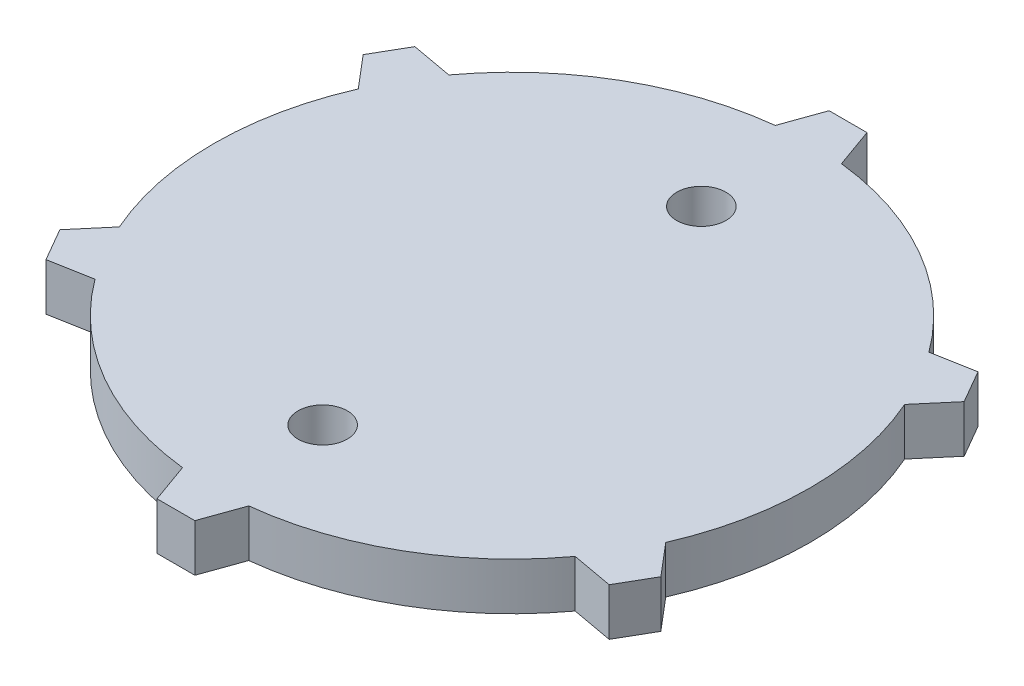
ISO-10303-21;
HEADER;
FILE_DESCRIPTION(('STEP AP214'),'2;1');
FILE_NAME('part.step','',(''),(''),'','','');
FILE_SCHEMA(('AUTOMOTIVE_DESIGN { 1 0 10303 214 1 1 1 1 }'));
ENDSEC;
DATA;
#1=APPLICATION_CONTEXT('core data for automotive mechanical design processes');
#2=APPLICATION_PROTOCOL_DEFINITION('international standard','automotive_design',2000,#1);
#3=PRODUCT_CONTEXT('',#1,'mechanical');
#4=PRODUCT('Part','Part','',(#3));
#5=PRODUCT_RELATED_PRODUCT_CATEGORY('part','',(#4));
#6=PRODUCT_DEFINITION_FORMATION('','',#4);
#7=PRODUCT_DEFINITION_CONTEXT('part definition',#1,'design');
#8=PRODUCT_DEFINITION('design','',#6,#7);
#9=PRODUCT_DEFINITION_SHAPE('','',#8);
#10=(LENGTH_UNIT() NAMED_UNIT(*) SI_UNIT(.MILLI.,.METRE.));
#11=(NAMED_UNIT(*) PLANE_ANGLE_UNIT() SI_UNIT($,.RADIAN.));
#12=(NAMED_UNIT(*) SI_UNIT($,.STERADIAN.) SOLID_ANGLE_UNIT());
#13=UNCERTAINTY_MEASURE_WITH_UNIT(LENGTH_MEASURE(1.E-05),#10,'distance_accuracy_value','');
#14=(GEOMETRIC_REPRESENTATION_CONTEXT(3) GLOBAL_UNCERTAINTY_ASSIGNED_CONTEXT((#13)) GLOBAL_UNIT_ASSIGNED_CONTEXT((#10,
#11,#12)) REPRESENTATION_CONTEXT('',''));
#15=CARTESIAN_POINT('',(0.,0.,0.));
#16=DIRECTION('',(0.,0.,1.));
#17=DIRECTION('',(1.,0.,0.));
#18=AXIS2_PLACEMENT_3D('',#15,#16,#17);
#19=CARTESIAN_POINT('',(2.47973046163203,5.,13.611639480181));
#20=DIRECTION('',(-0.179227336246984,0.,-0.983807685445591));
#21=DIRECTION('',(-0.983807685445591,0.,0.179227336246984));
#22=AXIS2_PLACEMENT_3D('',#19,#20,#21);
#23=PLANE('',#22);
#24=DIRECTION('',(0.983807685445591,0.,-0.179227336246984));
#25=VECTOR('',#24,1.);
#26=CARTESIAN_POINT('',(2.47973046163203,0.,13.611639480181));
#27=LINE('',#26,#25);
#28=CARTESIAN_POINT('',(-29.7439018343478,0.,19.4820508075686));
#29=VERTEX_POINT('',#28);
#30=CARTESIAN_POINT('',(-25.3608834234521,0.,18.6835647557438));
#31=VERTEX_POINT('',#30);
#32=EDGE_CURVE('E229',#29,#31,#27,.T.);
#33=ORIENTED_EDGE('',*,*,#32,.T.);
#34=DIRECTION('',(0.,-1.,0.));
#35=VECTOR('',#34,1.);
#36=CARTESIAN_POINT('',(-25.3608834234521,5.,18.6835647557438));
#37=LINE('',#36,#35);
#38=CARTESIAN_POINT('',(-25.3608834234521,5.,18.6835647557438));
#39=VERTEX_POINT('',#38);
#40=EDGE_CURVE('E11',#39,#31,#37,.T.);
#41=ORIENTED_EDGE('',*,*,#40,.F.);
#42=DIRECTION('',(0.983807685445591,0.,-0.179227336246984));
#43=VECTOR('',#42,1.);
#44=CARTESIAN_POINT('',(2.47973046163203,5.,13.611639480181));
#45=LINE('',#44,#43);
#46=CARTESIAN_POINT('',(-29.7439018343478,5.,19.4820508075686));
#47=VERTEX_POINT('',#46);
#48=EDGE_CURVE('E287',#47,#39,#45,.T.);
#49=ORIENTED_EDGE('',*,*,#48,.F.);
#50=DIRECTION('',(0.,-1.,0.));
#51=VECTOR('',#50,1.);
#52=CARTESIAN_POINT('',(-29.7439018343478,5.,19.4820508075686));
#53=LINE('',#52,#51);
#54=EDGE_CURVE('E225',#47,#29,#53,.T.);
#55=ORIENTED_EDGE('',*,*,#54,.T.);
#56=EDGE_LOOP('',(#33,#41,#49,#55));
#57=FACE_BOUND('',#56,.T.);
#58=ADVANCED_FACE('F38',(#57),#23,.F.);
#59=CARTESIAN_POINT('',(0.,5.,0.));
#60=DIRECTION('',(0.,-1.,0.));
#61=DIRECTION('',(0.,0.,-1.));
#62=AXIS2_PLACEMENT_3D('',#59,#60,#61);
#63=CYLINDRICAL_SURFACE('',#62,31.5);
#64=CARTESIAN_POINT('',(0.,0.,0.));
#65=DIRECTION('',(0.,1.,0.));
#66=DIRECTION('',(0.,0.,1.));
#67=AXIS2_PLACEMENT_3D('',#64,#65,#66);
#68=CIRCLE('',#67,31.5);
#69=CARTESIAN_POINT('',(-3.50000000000022,0.,31.304951684997));
#70=VERTEX_POINT('',#69);
#71=EDGE_CURVE('E232',#31,#70,#68,.T.);
#72=ORIENTED_EDGE('',*,*,#71,.T.);
#73=DIRECTION('',(0.,-1.,0.));
#74=VECTOR('',#73,1.);
#75=CARTESIAN_POINT('',(-3.50000000000022,5.,31.304951684997));
#76=LINE('',#75,#74);
#77=CARTESIAN_POINT('',(-3.50000000000022,5.,31.304951684997));
#78=VERTEX_POINT('',#77);
#79=EDGE_CURVE('E46',#78,#70,#76,.T.);
#80=ORIENTED_EDGE('',*,*,#79,.F.);
#81=CARTESIAN_POINT('',(0.,5.,0.));
#82=DIRECTION('',(0.,1.,0.));
#83=DIRECTION('',(0.,0.,1.));
#84=AXIS2_PLACEMENT_3D('',#81,#82,#83);
#85=CIRCLE('',#84,31.5);
#86=EDGE_CURVE('E141',#39,#78,#85,.T.);
#87=ORIENTED_EDGE('',*,*,#86,.F.);
#88=ORIENTED_EDGE('',*,*,#40,.T.);
#89=EDGE_LOOP('',(#72,#80,#87,#88));
#90=FACE_BOUND('',#89,.T.);
#91=ADVANCED_FACE('F341',(#90),#63,.T.);
#92=CARTESIAN_POINT('',(-13.0278908078081,5.,4.65831016577885));
#93=DIRECTION('',(-0.94161611615775,0.,0.336688416480276));
#94=DIRECTION('',(0.336688416480276,0.,0.94161611615775));
#95=AXIS2_PLACEMENT_3D('',#92,#93,#94);
#96=PLANE('',#95);
#97=DIRECTION('',(-0.336688416480276,0.,-0.941616116157749));
#98=VECTOR('',#97,1.);
#99=CARTESIAN_POINT('',(-13.0278908078081,0.,4.65831016577885));
#100=LINE('',#99,#98);
#101=CARTESIAN_POINT('',(-2.00000000000025,0.,35.5));
#102=VERTEX_POINT('',#101);
#103=EDGE_CURVE('E236',#102,#70,#100,.T.);
#104=ORIENTED_EDGE('',*,*,#103,.F.);
#105=DIRECTION('',(0.,-1.,0.));
#106=VECTOR('',#105,1.);
#107=CARTESIAN_POINT('',(-2.00000000000025,5.,35.5));
#108=LINE('',#107,#106);
#109=CARTESIAN_POINT('',(-2.00000000000025,5.,35.5));
#110=VERTEX_POINT('',#109);
#111=EDGE_CURVE('E334',#110,#102,#108,.T.);
#112=ORIENTED_EDGE('',*,*,#111,.F.);
#113=DIRECTION('',(-0.336688416480276,0.,-0.941616116157749));
#114=VECTOR('',#113,1.);
#115=CARTESIAN_POINT('',(-13.0278908078081,5.,4.65831016577885));
#116=LINE('',#115,#114);
#117=EDGE_CURVE('E340',#110,#78,#116,.T.);
#118=ORIENTED_EDGE('',*,*,#117,.T.);
#119=ORIENTED_EDGE('',*,*,#79,.T.);
#120=EDGE_LOOP('',(#104,#112,#118,#119));
#121=FACE_BOUND('',#120,.T.);
#122=ADVANCED_FACE('F338',(#121),#96,.T.);
#123=CARTESIAN_POINT('',(-2.46330733588707E-13,5.,35.5));
#124=DIRECTION('',(0.,0.,-1.));
#125=DIRECTION('',(-1.,0.,0.));
#126=AXIS2_PLACEMENT_3D('',#123,#124,#125);
#127=PLANE('',#126);
#128=DIRECTION('',(1.,0.,0.));
#129=VECTOR('',#128,1.);
#130=CARTESIAN_POINT('',(-2.46330733588707E-13,0.,35.5));
#131=LINE('',#130,#129);
#132=CARTESIAN_POINT('',(1.99999999999975,0.,35.5));
#133=VERTEX_POINT('',#132);
#134=EDGE_CURVE('E239',#102,#133,#131,.T.);
#135=ORIENTED_EDGE('',*,*,#134,.T.);
#136=DIRECTION('',(0.,-1.,0.));
#137=VECTOR('',#136,1.);
#138=CARTESIAN_POINT('',(1.99999999999975,5.,35.5));
#139=LINE('',#138,#137);
#140=CARTESIAN_POINT('',(1.99999999999975,5.,35.5));
#141=VERTEX_POINT('',#140);
#142=EDGE_CURVE('E331',#141,#133,#139,.T.);
#143=ORIENTED_EDGE('',*,*,#142,.F.);
#144=DIRECTION('',(1.,0.,0.));
#145=VECTOR('',#144,1.);
#146=CARTESIAN_POINT('',(-2.46330733588707E-13,5.,35.5));
#147=LINE('',#146,#145);
#148=EDGE_CURVE('E360',#110,#141,#147,.T.);
#149=ORIENTED_EDGE('',*,*,#148,.F.);
#150=ORIENTED_EDGE('',*,*,#111,.T.);
#151=EDGE_LOOP('',(#135,#143,#149,#150));
#152=FACE_BOUND('',#151,.T.);
#153=ADVANCED_FACE('F351',(#152),#127,.F.);
#154=CARTESIAN_POINT('',(13.027890807808,5.,4.65831016577904));
#155=DIRECTION('',(-0.941616116157745,0.,-0.33668841648029));
#156=DIRECTION('',(-0.33668841648029,0.,0.941616116157745));
#157=AXIS2_PLACEMENT_3D('',#154,#155,#156);
#158=PLANE('',#157);
#159=DIRECTION('',(0.33668841648029,0.,-0.941616116157745));
#160=VECTOR('',#159,1.);
#161=CARTESIAN_POINT('',(13.027890807808,0.,4.65831016577904));
#162=LINE('',#161,#160);
#163=CARTESIAN_POINT('',(3.49999999999978,0.,31.3049516849971));
#164=VERTEX_POINT('',#163);
#165=EDGE_CURVE('E241',#133,#164,#162,.T.);
#166=ORIENTED_EDGE('',*,*,#165,.T.);
#167=DIRECTION('',(0.,-1.,0.));
#168=VECTOR('',#167,1.);
#169=CARTESIAN_POINT('',(3.49999999999978,5.,31.3049516849971));
#170=LINE('',#169,#168);
#171=CARTESIAN_POINT('',(3.49999999999978,5.,31.3049516849971));
#172=VERTEX_POINT('',#171);
#173=EDGE_CURVE('E328',#172,#164,#170,.T.);
#174=ORIENTED_EDGE('',*,*,#173,.F.);
#175=DIRECTION('',(0.33668841648029,0.,-0.941616116157745));
#176=VECTOR('',#175,1.);
#177=CARTESIAN_POINT('',(13.027890807808,5.,4.65831016577904));
#178=LINE('',#177,#176);
#179=EDGE_CURVE('E357',#141,#172,#178,.T.);
#180=ORIENTED_EDGE('',*,*,#179,.F.);
#181=ORIENTED_EDGE('',*,*,#142,.T.);
#182=EDGE_LOOP('',(#166,#174,#180,#181));
#183=FACE_BOUND('',#182,.T.);
#184=ADVANCED_FACE('F355',(#183),#158,.F.);
#185=CARTESIAN_POINT('',(0.,5.,0.));
#186=DIRECTION('',(0.,-1.,0.));
#187=DIRECTION('',(0.,0.,-1.));
#188=AXIS2_PLACEMENT_3D('',#185,#186,#187);
#189=CYLINDRICAL_SURFACE('',#188,31.5);
#190=CARTESIAN_POINT('',(0.,0.,0.));
#191=DIRECTION('',(0.,1.,0.));
#192=DIRECTION('',(0.,0.,1.));
#193=AXIS2_PLACEMENT_3D('',#190,#191,#192);
#194=CIRCLE('',#193,31.5);
#195=CARTESIAN_POINT('',(25.3608834234518,0.,18.6835647557442));
#196=VERTEX_POINT('',#195);
#197=EDGE_CURVE('E243',#164,#196,#194,.T.);
#198=ORIENTED_EDGE('',*,*,#197,.T.);
#199=DIRECTION('',(0.,-1.,0.));
#200=VECTOR('',#199,1.);
#201=CARTESIAN_POINT('',(25.3608834234518,5.,18.6835647557442));
#202=LINE('',#201,#200);
#203=CARTESIAN_POINT('',(25.3608834234518,5.,18.6835647557442));
#204=VERTEX_POINT('',#203);
#205=EDGE_CURVE('E326',#204,#196,#202,.T.);
#206=ORIENTED_EDGE('',*,*,#205,.F.);
#207=CARTESIAN_POINT('',(0.,5.,0.));
#208=DIRECTION('',(0.,1.,0.));
#209=DIRECTION('',(0.,0.,1.));
#210=AXIS2_PLACEMENT_3D('',#207,#208,#209);
#211=CIRCLE('',#210,31.5);
#212=EDGE_CURVE('E359',#172,#204,#211,.T.);
#213=ORIENTED_EDGE('',*,*,#212,.F.);
#214=ORIENTED_EDGE('',*,*,#173,.T.);
#215=EDGE_LOOP('',(#198,#206,#213,#214));
#216=FACE_BOUND('',#215,.T.);
#217=ADVANCED_FACE('F432',(#216),#189,.T.);
#218=CARTESIAN_POINT('',(-2.47973046163222,5.,13.611639480181));
#219=DIRECTION('',(-0.179227336246998,0.,0.983807685445588));
#220=DIRECTION('',(0.983807685445588,0.,0.179227336246998));
#221=AXIS2_PLACEMENT_3D('',#218,#219,#220);
#222=PLANE('',#221);
#223=DIRECTION('',(-0.983807685445588,0.,-0.179227336246998));
#224=VECTOR('',#223,1.);
#225=CARTESIAN_POINT('',(-2.47973046163222,0.,13.611639480181));
#226=LINE('',#225,#224);
#227=CARTESIAN_POINT('',(29.7439018343475,0.,19.482050807569));
#228=VERTEX_POINT('',#227);
#229=EDGE_CURVE('E246',#228,#196,#226,.T.);
#230=ORIENTED_EDGE('',*,*,#229,.F.);
#231=DIRECTION('',(0.,-1.,0.));
#232=VECTOR('',#231,1.);
#233=CARTESIAN_POINT('',(29.7439018343475,5.,19.482050807569));
#234=LINE('',#233,#232);
#235=CARTESIAN_POINT('',(29.7439018343475,5.,19.482050807569));
#236=VERTEX_POINT('',#235);
#237=EDGE_CURVE('E324',#236,#228,#234,.T.);
#238=ORIENTED_EDGE('',*,*,#237,.F.);
#239=DIRECTION('',(-0.983807685445588,0.,-0.179227336246998));
#240=VECTOR('',#239,1.);
#241=CARTESIAN_POINT('',(-2.47973046163222,5.,13.611639480181));
#242=LINE('',#241,#240);
#243=EDGE_CURVE('E362',#236,#204,#242,.T.);
#244=ORIENTED_EDGE('',*,*,#243,.T.);
#245=ORIENTED_EDGE('',*,*,#205,.T.);
#246=EDGE_LOOP('',(#230,#238,#244,#245));
#247=FACE_BOUND('',#246,.T.);
#248=ADVANCED_FACE('F435',(#247),#222,.T.);
#249=CARTESIAN_POINT('',(30.7439018343475,5.,17.7500000000002));
#250=DIRECTION('',(-0.866025403784436,0.,-0.500000000000004));
#251=DIRECTION('',(-0.500000000000004,0.,0.866025403784436));
#252=AXIS2_PLACEMENT_3D('',#249,#250,#251);
#253=PLANE('',#252);
#254=DIRECTION('',(0.500000000000004,0.,-0.866025403784436));
#255=VECTOR('',#254,1.);
#256=CARTESIAN_POINT('',(30.7439018343475,0.,17.7500000000002));
#257=LINE('',#256,#255);
#258=CARTESIAN_POINT('',(31.7439018343475,0.,16.0179491924313));
#259=VERTEX_POINT('',#258);
#260=EDGE_CURVE('E249',#228,#259,#257,.T.);
#261=ORIENTED_EDGE('',*,*,#260,.T.);
#262=DIRECTION('',(0.,-1.,0.));
#263=VECTOR('',#262,1.);
#264=CARTESIAN_POINT('',(31.7439018343475,5.,16.0179491924313));
#265=LINE('',#264,#263);
#266=CARTESIAN_POINT('',(31.7439018343475,5.,16.0179491924313));
#267=VERTEX_POINT('',#266);
#268=EDGE_CURVE('E321',#267,#259,#265,.T.);
#269=ORIENTED_EDGE('',*,*,#268,.F.);
#270=DIRECTION('',(0.500000000000004,0.,-0.866025403784436));
#271=VECTOR('',#270,1.);
#272=CARTESIAN_POINT('',(30.7439018343475,5.,17.7500000000002));
#273=LINE('',#272,#271);
#274=EDGE_CURVE('E369',#236,#267,#273,.T.);
#275=ORIENTED_EDGE('',*,*,#274,.F.);
#276=ORIENTED_EDGE('',*,*,#237,.T.);
#277=EDGE_LOOP('',(#261,#269,#275,#276));
#278=FACE_BOUND('',#277,.T.);
#279=ADVANCED_FACE('F439',(#278),#253,.F.);
#280=CARTESIAN_POINT('',(10.548160346176,5.,-8.95332931440202));
#281=DIRECTION('',(-0.762388779910757,0.,0.647119268965302));
#282=DIRECTION('',(0.647119268965302,0.,0.762388779910757));
#283=AXIS2_PLACEMENT_3D('',#280,#281,#282);
#284=PLANE('',#283);
#285=DIRECTION('',(-0.647119268965302,0.,-0.762388779910757));
#286=VECTOR('',#285,1.);
#287=CARTESIAN_POINT('',(10.548160346176,0.,-8.95332931440202));
#288=LINE('',#287,#286);
#289=CARTESIAN_POINT('',(28.8608834234519,0.,12.6213869292531));
#290=VERTEX_POINT('',#289);
#291=EDGE_CURVE('E251',#259,#290,#288,.T.);
#292=ORIENTED_EDGE('',*,*,#291,.T.);
#293=DIRECTION('',(0.,-1.,0.));
#294=VECTOR('',#293,1.);
#295=CARTESIAN_POINT('',(28.8608834234519,5.,12.6213869292531));
#296=LINE('',#295,#294);
#297=CARTESIAN_POINT('',(28.8608834234519,5.,12.6213869292531));
#298=VERTEX_POINT('',#297);
#299=EDGE_CURVE('E318',#298,#290,#296,.T.);
#300=ORIENTED_EDGE('',*,*,#299,.F.);
#301=DIRECTION('',(-0.647119268965302,0.,-0.762388779910757));
#302=VECTOR('',#301,1.);
#303=CARTESIAN_POINT('',(10.548160346176,5.,-8.95332931440202));
#304=LINE('',#303,#302);
#305=EDGE_CURVE('E371',#267,#298,#304,.T.);
#306=ORIENTED_EDGE('',*,*,#305,.F.);
#307=ORIENTED_EDGE('',*,*,#268,.T.);
#308=EDGE_LOOP('',(#292,#300,#306,#307));
#309=FACE_BOUND('',#308,.T.);
#310=ADVANCED_FACE('F443',(#309),#284,.F.);
#311=CARTESIAN_POINT('',(0.,5.,0.));
#312=DIRECTION('',(0.,-1.,0.));
#313=DIRECTION('',(0.,0.,-1.));
#314=AXIS2_PLACEMENT_3D('',#311,#312,#313);
#315=CYLINDRICAL_SURFACE('',#314,31.5);
#316=CARTESIAN_POINT('',(0.,0.,0.));
#317=DIRECTION('',(0.,1.,0.));
#318=DIRECTION('',(0.,0.,1.));
#319=AXIS2_PLACEMENT_3D('',#316,#317,#318);
#320=CIRCLE('',#319,31.5);
#321=CARTESIAN_POINT('',(28.860883423452,0.,-12.6213869292529));
#322=VERTEX_POINT('',#321);
#323=EDGE_CURVE('E253',#290,#322,#320,.T.);
#324=ORIENTED_EDGE('',*,*,#323,.T.);
#325=DIRECTION('',(0.,-1.,0.));
#326=VECTOR('',#325,1.);
#327=CARTESIAN_POINT('',(28.860883423452,5.,-12.6213869292529));
#328=LINE('',#327,#326);
#329=CARTESIAN_POINT('',(28.860883423452,5.,-12.6213869292529));
#330=VERTEX_POINT('',#329);
#331=EDGE_CURVE('E316',#330,#322,#328,.T.);
#332=ORIENTED_EDGE('',*,*,#331,.F.);
#333=CARTESIAN_POINT('',(0.,5.,0.));
#334=DIRECTION('',(0.,1.,0.));
#335=DIRECTION('',(0.,0.,1.));
#336=AXIS2_PLACEMENT_3D('',#333,#334,#335);
#337=CIRCLE('',#336,31.5);
#338=EDGE_CURVE('E373',#298,#330,#337,.T.);
#339=ORIENTED_EDGE('',*,*,#338,.F.);
#340=ORIENTED_EDGE('',*,*,#299,.T.);
#341=EDGE_LOOP('',(#324,#332,#339,#340));
#342=FACE_BOUND('',#341,.T.);
#343=ADVANCED_FACE('F447',(#342),#315,.T.);
#344=CARTESIAN_POINT('',(10.5481603461759,5.,8.9533293144021));
#345=DIRECTION('',(0.762388779910753,0.,0.647119268965307));
#346=DIRECTION('',(0.647119268965307,0.,-0.762388779910753));
#347=AXIS2_PLACEMENT_3D('',#344,#345,#346);
#348=PLANE('',#347);
#349=DIRECTION('',(-0.647119268965307,0.,0.762388779910753));
#350=VECTOR('',#349,1.);
#351=CARTESIAN_POINT('',(10.5481603461759,0.,8.9533293144021));
#352=LINE('',#351,#350);
#353=CARTESIAN_POINT('',(31.7439018343476,0.,-16.0179491924311));
#354=VERTEX_POINT('',#353);
#355=EDGE_CURVE('E256',#354,#322,#352,.T.);
#356=ORIENTED_EDGE('',*,*,#355,.F.);
#357=DIRECTION('',(0.,-1.,0.));
#358=VECTOR('',#357,1.);
#359=CARTESIAN_POINT('',(31.7439018343476,5.,-16.0179491924311));
#360=LINE('',#359,#358);
#361=CARTESIAN_POINT('',(31.7439018343476,5.,-16.0179491924311));
#362=VERTEX_POINT('',#361);
#363=EDGE_CURVE('E314',#362,#354,#360,.T.);
#364=ORIENTED_EDGE('',*,*,#363,.F.);
#365=DIRECTION('',(-0.647119268965307,0.,0.762388779910753));
#366=VECTOR('',#365,1.);
#367=CARTESIAN_POINT('',(10.5481603461759,5.,8.9533293144021));
#368=LINE('',#367,#366);
#369=EDGE_CURVE('E375',#362,#330,#368,.T.);
#370=ORIENTED_EDGE('',*,*,#369,.T.);
#371=ORIENTED_EDGE('',*,*,#331,.T.);
#372=EDGE_LOOP('',(#356,#364,#370,#371));
#373=FACE_BOUND('',#372,.T.);
#374=ADVANCED_FACE('F451',(#373),#348,.T.);
#375=CARTESIAN_POINT('',(30.7439018343476,5.,-17.7499999999999));
#376=DIRECTION('',(-0.86602540378444,0.,0.499999999999998));
#377=DIRECTION('',(0.499999999999998,0.,0.86602540378444));
#378=AXIS2_PLACEMENT_3D('',#375,#376,#377);
#379=PLANE('',#378);
#380=DIRECTION('',(-0.499999999999998,0.,-0.86602540378444));
#381=VECTOR('',#380,1.);
#382=CARTESIAN_POINT('',(30.7439018343476,0.,-17.7499999999999));
#383=LINE('',#382,#381);
#384=CARTESIAN_POINT('',(29.7439018343476,0.,-19.4820508075688));
#385=VERTEX_POINT('',#384);
#386=EDGE_CURVE('E259',#354,#385,#383,.T.);
#387=ORIENTED_EDGE('',*,*,#386,.T.);
#388=DIRECTION('',(0.,-1.,0.));
#389=VECTOR('',#388,1.);
#390=CARTESIAN_POINT('',(29.7439018343476,5.,-19.4820508075688));
#391=LINE('',#390,#389);
#392=CARTESIAN_POINT('',(29.7439018343476,5.,-19.4820508075688));
#393=VERTEX_POINT('',#392);
#394=EDGE_CURVE('E311',#393,#385,#391,.T.);
#395=ORIENTED_EDGE('',*,*,#394,.F.);
#396=DIRECTION('',(-0.499999999999998,0.,-0.86602540378444));
#397=VECTOR('',#396,1.);
#398=CARTESIAN_POINT('',(30.7439018343476,5.,-17.7499999999999));
#399=LINE('',#398,#397);
#400=EDGE_CURVE('E378',#362,#393,#399,.T.);
#401=ORIENTED_EDGE('',*,*,#400,.F.);
#402=ORIENTED_EDGE('',*,*,#363,.T.);
#403=EDGE_LOOP('',(#387,#395,#401,#402));
#404=FACE_BOUND('',#403,.T.);
#405=ADVANCED_FACE('F455',(#404),#379,.F.);
#406=CARTESIAN_POINT('',(-2.47973046163212,5.,-13.611639480181));
#407=DIRECTION('',(0.179227336246991,0.,0.983807685445589));
#408=DIRECTION('',(0.98380768544559,0.,-0.179227336246991));
#409=AXIS2_PLACEMENT_3D('',#406,#407,#408);
#410=PLANE('',#409);
#411=DIRECTION('',(-0.983807685445589,0.,0.179227336246991));
#412=VECTOR('',#411,1.);
#413=CARTESIAN_POINT('',(-2.47973046163212,0.,-13.611639480181));
#414=LINE('',#413,#412);
#415=CARTESIAN_POINT('',(25.360883423452,0.,-18.683564755744));
#416=VERTEX_POINT('',#415);
#417=EDGE_CURVE('E261',#385,#416,#414,.T.);
#418=ORIENTED_EDGE('',*,*,#417,.T.);
#419=DIRECTION('',(0.,-1.,0.));
#420=VECTOR('',#419,1.);
#421=CARTESIAN_POINT('',(25.360883423452,5.,-18.683564755744));
#422=LINE('',#421,#420);
#423=CARTESIAN_POINT('',(25.360883423452,5.,-18.683564755744));
#424=VERTEX_POINT('',#423);
#425=EDGE_CURVE('E308',#424,#416,#422,.T.);
#426=ORIENTED_EDGE('',*,*,#425,.F.);
#427=DIRECTION('',(-0.983807685445589,0.,0.179227336246991));
#428=VECTOR('',#427,1.);
#429=CARTESIAN_POINT('',(-2.47973046163212,5.,-13.611639480181));
#430=LINE('',#429,#428);
#431=EDGE_CURVE('E380',#393,#424,#430,.T.);
#432=ORIENTED_EDGE('',*,*,#431,.F.);
#433=ORIENTED_EDGE('',*,*,#394,.T.);
#434=EDGE_LOOP('',(#418,#426,#432,#433));
#435=FACE_BOUND('',#434,.T.);
#436=ADVANCED_FACE('F459',(#435),#410,.F.);
#437=CARTESIAN_POINT('',(0.,5.,0.));
#438=DIRECTION('',(0.,-1.,0.));
#439=DIRECTION('',(0.,0.,-1.));
#440=AXIS2_PLACEMENT_3D('',#437,#438,#439);
#441=CYLINDRICAL_SURFACE('',#440,31.5);
#442=CARTESIAN_POINT('',(0.,0.,0.));
#443=DIRECTION('',(0.,1.,0.));
#444=DIRECTION('',(0.,0.,1.));
#445=AXIS2_PLACEMENT_3D('',#442,#443,#444);
#446=CIRCLE('',#445,31.5);
#447=CARTESIAN_POINT('',(3.5,0.,-31.3049516849971));
#448=VERTEX_POINT('',#447);
#449=EDGE_CURVE('E263',#416,#448,#446,.T.);
#450=ORIENTED_EDGE('',*,*,#449,.T.);
#451=DIRECTION('',(0.,-1.,0.));
#452=VECTOR('',#451,1.);
#453=CARTESIAN_POINT('',(3.5,5.,-31.3049516849971));
#454=LINE('',#453,#452);
#455=CARTESIAN_POINT('',(3.5,5.,-31.3049516849971));
#456=VERTEX_POINT('',#455);
#457=EDGE_CURVE('E306',#456,#448,#454,.T.);
#458=ORIENTED_EDGE('',*,*,#457,.F.);
#459=CARTESIAN_POINT('',(0.,5.,0.));
#460=DIRECTION('',(0.,1.,0.));
#461=DIRECTION('',(0.,0.,1.));
#462=AXIS2_PLACEMENT_3D('',#459,#460,#461);
#463=CIRCLE('',#462,31.5);
#464=EDGE_CURVE('E382',#424,#456,#463,.T.);
#465=ORIENTED_EDGE('',*,*,#464,.F.);
#466=ORIENTED_EDGE('',*,*,#425,.T.);
#467=EDGE_LOOP('',(#450,#458,#465,#466));
#468=FACE_BOUND('',#467,.T.);
#469=ADVANCED_FACE('F463',(#468),#441,.T.);
#470=CARTESIAN_POINT('',(13.027890807808,5.,-4.65831016577894));
#471=DIRECTION('',(0.941616116157747,0.,-0.336688416480283));
#472=DIRECTION('',(-0.336688416480283,0.,-0.941616116157747));
#473=AXIS2_PLACEMENT_3D('',#470,#471,#472);
#474=PLANE('',#473);
#475=DIRECTION('',(0.336688416480283,0.,0.941616116157747));
#476=VECTOR('',#475,1.);
#477=CARTESIAN_POINT('',(13.027890807808,0.,-4.65831016577894));
#478=LINE('',#477,#476);
#479=CARTESIAN_POINT('',(2.,0.,-35.5));
#480=VERTEX_POINT('',#479);
#481=EDGE_CURVE('E266',#480,#448,#478,.T.);
#482=ORIENTED_EDGE('',*,*,#481,.F.);
#483=DIRECTION('',(0.,-1.,0.));
#484=VECTOR('',#483,1.);
#485=CARTESIAN_POINT('',(2.,5.,-35.5));
#486=LINE('',#485,#484);
#487=CARTESIAN_POINT('',(2.,5.,-35.5));
#488=VERTEX_POINT('',#487);
#489=EDGE_CURVE('E304',#488,#480,#486,.T.);
#490=ORIENTED_EDGE('',*,*,#489,.F.);
#491=DIRECTION('',(0.336688416480283,0.,0.941616116157747));
#492=VECTOR('',#491,1.);
#493=CARTESIAN_POINT('',(13.027890807808,5.,-4.65831016577894));
#494=LINE('',#493,#492);
#495=EDGE_CURVE('E384',#488,#456,#494,.T.);
#496=ORIENTED_EDGE('',*,*,#495,.T.);
#497=ORIENTED_EDGE('',*,*,#457,.T.);
#498=EDGE_LOOP('',(#482,#490,#496,#497));
#499=FACE_BOUND('',#498,.T.);
#500=ADVANCED_FACE('F467',(#499),#474,.T.);
#501=CARTESIAN_POINT('',(0.,5.,-35.5));
#502=DIRECTION('',(0.,0.,1.));
#503=DIRECTION('',(1.,0.,0.));
#504=AXIS2_PLACEMENT_3D('',#501,#502,#503);
#505=PLANE('',#504);
#506=DIRECTION('',(-1.,0.,0.));
#507=VECTOR('',#506,1.);
#508=CARTESIAN_POINT('',(0.,0.,-35.5));
#509=LINE('',#508,#507);
#510=CARTESIAN_POINT('',(-2.,0.,-35.5));
#511=VERTEX_POINT('',#510);
#512=EDGE_CURVE('E269',#480,#511,#509,.T.);
#513=ORIENTED_EDGE('',*,*,#512,.T.);
#514=DIRECTION('',(0.,-1.,0.));
#515=VECTOR('',#514,1.);
#516=CARTESIAN_POINT('',(-2.,5.,-35.5));
#517=LINE('',#516,#515);
#518=CARTESIAN_POINT('',(-2.,5.,-35.5));
#519=VERTEX_POINT('',#518);
#520=EDGE_CURVE('E301',#519,#511,#517,.T.);
#521=ORIENTED_EDGE('',*,*,#520,.F.);
#522=DIRECTION('',(-1.,0.,0.));
#523=VECTOR('',#522,1.);
#524=CARTESIAN_POINT('',(0.,5.,-35.5));
#525=LINE('',#524,#523);
#526=EDGE_CURVE('E387',#488,#519,#525,.T.);
#527=ORIENTED_EDGE('',*,*,#526,.F.);
#528=ORIENTED_EDGE('',*,*,#489,.T.);
#529=EDGE_LOOP('',(#513,#521,#527,#528));
#530=FACE_BOUND('',#529,.T.);
#531=ADVANCED_FACE('F471',(#530),#505,.F.);
#532=CARTESIAN_POINT('',(-13.027890807808,5.,-4.65831016577894));
#533=DIRECTION('',(0.941616116157747,0.,0.336688416480283));
#534=DIRECTION('',(0.336688416480283,0.,-0.941616116157747));
#535=AXIS2_PLACEMENT_3D('',#532,#533,#534);
#536=PLANE('',#535);
#537=DIRECTION('',(-0.336688416480283,0.,0.941616116157747));
#538=VECTOR('',#537,1.);
#539=CARTESIAN_POINT('',(-13.027890807808,0.,-4.65831016577894));
#540=LINE('',#539,#538);
#541=CARTESIAN_POINT('',(-3.5,0.,-31.3049516849971));
#542=VERTEX_POINT('',#541);
#543=EDGE_CURVE('E271',#511,#542,#540,.T.);
#544=ORIENTED_EDGE('',*,*,#543,.T.);
#545=DIRECTION('',(0.,-1.,0.));
#546=VECTOR('',#545,1.);
#547=CARTESIAN_POINT('',(-3.5,5.,-31.3049516849971));
#548=LINE('',#547,#546);
#549=CARTESIAN_POINT('',(-3.5,5.,-31.3049516849971));
#550=VERTEX_POINT('',#549);
#551=EDGE_CURVE('E298',#550,#542,#548,.T.);
#552=ORIENTED_EDGE('',*,*,#551,.F.);
#553=DIRECTION('',(-0.336688416480283,0.,0.941616116157747));
#554=VECTOR('',#553,1.);
#555=CARTESIAN_POINT('',(-13.027890807808,5.,-4.65831016577894));
#556=LINE('',#555,#554);
#557=EDGE_CURVE('E389',#519,#550,#556,.T.);
#558=ORIENTED_EDGE('',*,*,#557,.F.);
#559=ORIENTED_EDGE('',*,*,#520,.T.);
#560=EDGE_LOOP('',(#544,#552,#558,#559));
#561=FACE_BOUND('',#560,.T.);
#562=ADVANCED_FACE('F475',(#561),#536,.F.);
#563=CARTESIAN_POINT('',(0.,5.,0.));
#564=DIRECTION('',(0.,-1.,0.));
#565=DIRECTION('',(0.,0.,-1.));
#566=AXIS2_PLACEMENT_3D('',#563,#564,#565);
#567=CYLINDRICAL_SURFACE('',#566,31.5);
#568=CARTESIAN_POINT('',(0.,0.,0.));
#569=DIRECTION('',(0.,1.,0.));
#570=DIRECTION('',(0.,0.,1.));
#571=AXIS2_PLACEMENT_3D('',#568,#569,#570);
#572=CIRCLE('',#571,31.5);
#573=CARTESIAN_POINT('',(-25.3608834234517,0.,-18.6835647557444));
#574=VERTEX_POINT('',#573);
#575=EDGE_CURVE('E273',#542,#574,#572,.T.);
#576=ORIENTED_EDGE('',*,*,#575,.T.);
#577=DIRECTION('',(0.,-1.,0.));
#578=VECTOR('',#577,1.);
#579=CARTESIAN_POINT('',(-25.3608834234517,5.,-18.6835647557444));
#580=LINE('',#579,#578);
#581=CARTESIAN_POINT('',(-25.3608834234517,5.,-18.6835647557444));
#582=VERTEX_POINT('',#581);
#583=EDGE_CURVE('E296',#582,#574,#580,.T.);
#584=ORIENTED_EDGE('',*,*,#583,.F.);
#585=CARTESIAN_POINT('',(0.,5.,0.));
#586=DIRECTION('',(0.,1.,0.));
#587=DIRECTION('',(0.,0.,1.));
#588=AXIS2_PLACEMENT_3D('',#585,#586,#587);
#589=CIRCLE('',#588,31.5);
#590=EDGE_CURVE('E391',#550,#582,#589,.T.);
#591=ORIENTED_EDGE('',*,*,#590,.F.);
#592=ORIENTED_EDGE('',*,*,#551,.T.);
#593=EDGE_LOOP('',(#576,#584,#591,#592));
#594=FACE_BOUND('',#593,.T.);
#595=ADVANCED_FACE('F479',(#594),#567,.T.);
#596=CARTESIAN_POINT('',(2.47973046163231,5.,-13.611639480181));
#597=DIRECTION('',(0.179227336247005,0.,-0.983807685445587));
#598=DIRECTION('',(-0.983807685445587,0.,-0.179227336247005));
#599=AXIS2_PLACEMENT_3D('',#596,#597,#598);
#600=PLANE('',#599);
#601=DIRECTION('',(0.983807685445587,0.,0.179227336247005));
#602=VECTOR('',#601,1.);
#603=CARTESIAN_POINT('',(2.47973046163231,0.,-13.611639480181));
#604=LINE('',#603,#602);
#605=CARTESIAN_POINT('',(-29.7439018343474,0.,-19.4820508075692));
#606=VERTEX_POINT('',#605);
#607=EDGE_CURVE('E276',#606,#574,#604,.T.);
#608=ORIENTED_EDGE('',*,*,#607,.F.);
#609=DIRECTION('',(0.,-1.,0.));
#610=VECTOR('',#609,1.);
#611=CARTESIAN_POINT('',(-29.7439018343474,5.,-19.4820508075692));
#612=LINE('',#611,#610);
#613=CARTESIAN_POINT('',(-29.7439018343474,5.,-19.4820508075692));
#614=VERTEX_POINT('',#613);
#615=EDGE_CURVE('E294',#614,#606,#612,.T.);
#616=ORIENTED_EDGE('',*,*,#615,.F.);
#617=DIRECTION('',(0.983807685445587,0.,0.179227336247005));
#618=VECTOR('',#617,1.);
#619=CARTESIAN_POINT('',(2.47973046163231,5.,-13.611639480181));
#620=LINE('',#619,#618);
#621=EDGE_CURVE('E393',#614,#582,#620,.T.);
#622=ORIENTED_EDGE('',*,*,#621,.T.);
#623=ORIENTED_EDGE('',*,*,#583,.T.);
#624=EDGE_LOOP('',(#608,#616,#622,#623));
#625=FACE_BOUND('',#624,.T.);
#626=ADVANCED_FACE('F483',(#625),#600,.T.);
#627=CARTESIAN_POINT('',(-30.7439018343474,5.,-17.7500000000004));
#628=DIRECTION('',(0.866025403784433,0.,0.50000000000001));
#629=DIRECTION('',(0.50000000000001,0.,-0.866025403784433));
#630=AXIS2_PLACEMENT_3D('',#627,#628,#629);
#631=PLANE('',#630);
#632=DIRECTION('',(-0.50000000000001,0.,0.866025403784433));
#633=VECTOR('',#632,1.);
#634=CARTESIAN_POINT('',(-30.7439018343474,0.,-17.7500000000004));
#635=LINE('',#634,#633);
#636=CARTESIAN_POINT('',(-31.7439018343474,0.,-16.0179491924315));
#637=VERTEX_POINT('',#636);
#638=EDGE_CURVE('E279',#606,#637,#635,.T.);
#639=ORIENTED_EDGE('',*,*,#638,.T.);
#640=DIRECTION('',(0.,-1.,0.));
#641=VECTOR('',#640,1.);
#642=CARTESIAN_POINT('',(-31.7439018343474,5.,-16.0179491924315));
#643=LINE('',#642,#641);
#644=CARTESIAN_POINT('',(-31.7439018343474,5.,-16.0179491924315));
#645=VERTEX_POINT('',#644);
#646=EDGE_CURVE('E291',#645,#637,#643,.T.);
#647=ORIENTED_EDGE('',*,*,#646,.F.);
#648=DIRECTION('',(-0.50000000000001,0.,0.866025403784433));
#649=VECTOR('',#648,1.);
#650=CARTESIAN_POINT('',(-30.7439018343474,5.,-17.7500000000004));
#651=LINE('',#650,#649);
#652=EDGE_CURVE('E396',#614,#645,#651,.T.);
#653=ORIENTED_EDGE('',*,*,#652,.F.);
#654=ORIENTED_EDGE('',*,*,#615,.T.);
#655=EDGE_LOOP('',(#639,#647,#653,#654));
#656=FACE_BOUND('',#655,.T.);
#657=ADVANCED_FACE('F401',(#656),#631,.F.);
#658=CARTESIAN_POINT('',(-10.548160346176,5.,8.95332931440194));
#659=DIRECTION('',(0.762388779910761,0.,-0.647119268965297));
#660=DIRECTION('',(-0.647119268965297,0.,-0.762388779910761));
#661=AXIS2_PLACEMENT_3D('',#658,#659,#660);
#662=PLANE('',#661);
#663=DIRECTION('',(0.647119268965297,0.,0.762388779910761));
#664=VECTOR('',#663,1.);
#665=CARTESIAN_POINT('',(-10.548160346176,0.,8.95332931440194));
#666=LINE('',#665,#664);
#667=CARTESIAN_POINT('',(-28.8608834234518,0.,-12.6213869292533));
#668=VERTEX_POINT('',#667);
#669=EDGE_CURVE('E281',#637,#668,#666,.T.);
#670=ORIENTED_EDGE('',*,*,#669,.T.);
#671=DIRECTION('',(0.,-1.,0.));
#672=VECTOR('',#671,1.);
#673=CARTESIAN_POINT('',(-28.8608834234518,5.,-12.6213869292533));
#674=LINE('',#673,#672);
#675=CARTESIAN_POINT('',(-28.8608834234518,5.,-12.6213869292533));
#676=VERTEX_POINT('',#675);
#677=EDGE_CURVE('E221',#676,#668,#674,.T.);
#678=ORIENTED_EDGE('',*,*,#677,.F.);
#679=DIRECTION('',(0.647119268965297,0.,0.762388779910761));
#680=VECTOR('',#679,1.);
#681=CARTESIAN_POINT('',(-10.548160346176,5.,8.95332931440194));
#682=LINE('',#681,#680);
#683=EDGE_CURVE('E208',#645,#676,#682,.T.);
#684=ORIENTED_EDGE('',*,*,#683,.F.);
#685=ORIENTED_EDGE('',*,*,#646,.T.);
#686=EDGE_LOOP('',(#670,#678,#684,#685));
#687=FACE_BOUND('',#686,.T.);
#688=ADVANCED_FACE('F405',(#687),#662,.F.);
#689=CARTESIAN_POINT('',(0.,5.,0.));
#690=DIRECTION('',(0.,-1.,0.));
#691=DIRECTION('',(0.,0.,-1.));
#692=AXIS2_PLACEMENT_3D('',#689,#690,#691);
#693=CYLINDRICAL_SURFACE('',#692,31.5);
#694=CARTESIAN_POINT('',(0.,0.,0.));
#695=DIRECTION('',(0.,1.,0.));
#696=DIRECTION('',(0.,0.,1.));
#697=AXIS2_PLACEMENT_3D('',#694,#695,#696);
#698=CIRCLE('',#697,31.5);
#699=CARTESIAN_POINT('',(-28.860883423452,0.,12.6213869292527));
#700=VERTEX_POINT('',#699);
#701=EDGE_CURVE('E217',#668,#700,#698,.T.);
#702=ORIENTED_EDGE('',*,*,#701,.T.);
#703=DIRECTION('',(0.,-1.,0.));
#704=VECTOR('',#703,1.);
#705=CARTESIAN_POINT('',(-28.860883423452,5.,12.6213869292527));
#706=LINE('',#705,#704);
#707=CARTESIAN_POINT('',(-28.860883423452,5.,12.6213869292527));
#708=VERTEX_POINT('',#707);
#709=EDGE_CURVE('E214',#708,#700,#706,.T.);
#710=ORIENTED_EDGE('',*,*,#709,.F.);
#711=CARTESIAN_POINT('',(0.,5.,0.));
#712=DIRECTION('',(0.,1.,0.));
#713=DIRECTION('',(0.,0.,1.));
#714=AXIS2_PLACEMENT_3D('',#711,#712,#713);
#715=CIRCLE('',#714,31.5);
#716=EDGE_CURVE('E202',#676,#708,#715,.T.);
#717=ORIENTED_EDGE('',*,*,#716,.F.);
#718=ORIENTED_EDGE('',*,*,#677,.T.);
#719=EDGE_LOOP('',(#702,#710,#717,#718));
#720=FACE_BOUND('',#719,.T.);
#721=ADVANCED_FACE('F215',(#720),#693,.T.);
#722=CARTESIAN_POINT('',(-10.5481603461758,5.,-8.95332931440216));
#723=DIRECTION('',(-0.762388779910748,0.,-0.647119268965313));
#724=DIRECTION('',(-0.647119268965313,0.,0.762388779910748));
#725=AXIS2_PLACEMENT_3D('',#722,#723,#724);
#726=PLANE('',#725);
#727=DIRECTION('',(0.647119268965313,0.,-0.762388779910748));
#728=VECTOR('',#727,1.);
#729=CARTESIAN_POINT('',(-10.5481603461758,0.,-8.95332931440216));
#730=LINE('',#729,#728);
#731=CARTESIAN_POINT('',(-31.7439018343477,0.,16.0179491924308));
#732=VERTEX_POINT('',#731);
#733=EDGE_CURVE('E284',#732,#700,#730,.T.);
#734=ORIENTED_EDGE('',*,*,#733,.F.);
#735=DIRECTION('',(0.,-1.,0.));
#736=VECTOR('',#735,1.);
#737=CARTESIAN_POINT('',(-31.7439018343477,5.,16.0179491924308));
#738=LINE('',#737,#736);
#739=CARTESIAN_POINT('',(-31.7439018343477,5.,16.0179491924308));
#740=VERTEX_POINT('',#739);
#741=EDGE_CURVE('E130',#740,#732,#738,.T.);
#742=ORIENTED_EDGE('',*,*,#741,.F.);
#743=DIRECTION('',(0.647119268965313,0.,-0.762388779910748));
#744=VECTOR('',#743,1.);
#745=CARTESIAN_POINT('',(-10.5481603461758,5.,-8.95332931440216));
#746=LINE('',#745,#744);
#747=EDGE_CURVE('E206',#740,#708,#746,.T.);
#748=ORIENTED_EDGE('',*,*,#747,.T.);
#749=ORIENTED_EDGE('',*,*,#709,.T.);
#750=EDGE_LOOP('',(#734,#742,#748,#749));
#751=FACE_BOUND('',#750,.T.);
#752=ADVANCED_FACE('F223',(#751),#726,.T.);
#753=CARTESIAN_POINT('',(-30.7439018343477,5.,17.7499999999997));
#754=DIRECTION('',(0.866025403784443,0.,-0.499999999999992));
#755=DIRECTION('',(-0.499999999999992,0.,-0.866025403784443));
#756=AXIS2_PLACEMENT_3D('',#753,#754,#755);
#757=PLANE('',#756);
#758=DIRECTION('',(0.499999999999992,0.,0.866025403784443));
#759=VECTOR('',#758,1.);
#760=CARTESIAN_POINT('',(-30.7439018343477,0.,17.7499999999997));
#761=LINE('',#760,#759);
#762=EDGE_CURVE('E133',#732,#29,#761,.T.);
#763=ORIENTED_EDGE('',*,*,#762,.T.);
#764=ORIENTED_EDGE('',*,*,#54,.F.);
#765=DIRECTION('',(0.499999999999992,0.,0.866025403784443));
#766=VECTOR('',#765,1.);
#767=CARTESIAN_POINT('',(-30.7439018343477,5.,17.7499999999997));
#768=LINE('',#767,#766);
#769=EDGE_CURVE('E54',#740,#47,#768,.T.);
#770=ORIENTED_EDGE('',*,*,#769,.F.);
#771=ORIENTED_EDGE('',*,*,#741,.T.);
#772=EDGE_LOOP('',(#763,#764,#770,#771));
#773=FACE_BOUND('',#772,.T.);
#774=ADVANCED_FACE('F408',(#773),#757,.F.);
#775=CARTESIAN_POINT('',(0.,5.,0.));
#776=DIRECTION('',(0.,1.,0.));
#777=DIRECTION('',(0.,0.,1.));
#778=AXIS2_PLACEMENT_3D('',#775,#776,#777);
#779=PLANE('',#778);
#780=CARTESIAN_POINT('',(0.,5.,-20.));
#781=DIRECTION('',(0.,1.,0.));
#782=DIRECTION('',(0.,0.,1.));
#783=AXIS2_PLACEMENT_3D('',#780,#781,#782);
#784=CIRCLE('',#783,2.6);
#785=CARTESIAN_POINT('',(0.,5.,-17.4));
#786=VERTEX_POINT('',#785);
#787=EDGE_CURVE('E548',#786,#786,#784,.T.);
#788=ORIENTED_EDGE('',*,*,#787,.F.);
#789=EDGE_LOOP('',(#788));
#790=FACE_BOUND('',#789,.T.);
#791=CARTESIAN_POINT('',(0.,5.,20.));
#792=DIRECTION('',(0.,1.,0.));
#793=DIRECTION('',(0.,0.,-1.));
#794=AXIS2_PLACEMENT_3D('',#791,#792,#793);
#795=CIRCLE('',#794,2.6);
#796=CARTESIAN_POINT('',(0.,5.,17.4));
#797=VERTEX_POINT('',#796);
#798=EDGE_CURVE('E553',#797,#797,#795,.T.);
#799=ORIENTED_EDGE('',*,*,#798,.F.);
#800=EDGE_LOOP('',(#799));
#801=FACE_BOUND('',#800,.T.);
#802=ORIENTED_EDGE('',*,*,#48,.T.);
#803=ORIENTED_EDGE('',*,*,#86,.T.);
#804=ORIENTED_EDGE('',*,*,#117,.F.);
#805=ORIENTED_EDGE('',*,*,#148,.T.);
#806=ORIENTED_EDGE('',*,*,#179,.T.);
#807=ORIENTED_EDGE('',*,*,#212,.T.);
#808=ORIENTED_EDGE('',*,*,#243,.F.);
#809=ORIENTED_EDGE('',*,*,#274,.T.);
#810=ORIENTED_EDGE('',*,*,#305,.T.);
#811=ORIENTED_EDGE('',*,*,#338,.T.);
#812=ORIENTED_EDGE('',*,*,#369,.F.);
#813=ORIENTED_EDGE('',*,*,#400,.T.);
#814=ORIENTED_EDGE('',*,*,#431,.T.);
#815=ORIENTED_EDGE('',*,*,#464,.T.);
#816=ORIENTED_EDGE('',*,*,#495,.F.);
#817=ORIENTED_EDGE('',*,*,#526,.T.);
#818=ORIENTED_EDGE('',*,*,#557,.T.);
#819=ORIENTED_EDGE('',*,*,#590,.T.);
#820=ORIENTED_EDGE('',*,*,#621,.F.);
#821=ORIENTED_EDGE('',*,*,#652,.T.);
#822=ORIENTED_EDGE('',*,*,#683,.T.);
#823=ORIENTED_EDGE('',*,*,#716,.T.);
#824=ORIENTED_EDGE('',*,*,#747,.F.);
#825=ORIENTED_EDGE('',*,*,#769,.T.);
#826=EDGE_LOOP('',(#802,#803,#804,#805,#806,#807,#808,#809,#810,#811,#812,#813,#814,#815,#816,
#817,#818,#819,#820,#821,#822,#823,#824,#825));
#827=FACE_BOUND('',#826,.T.);
#828=ADVANCED_FACE('F204',(#790,#801,#827),#779,.T.);
#829=CARTESIAN_POINT('',(0.,0.,0.));
#830=DIRECTION('',(0.,1.,0.));
#831=DIRECTION('',(0.,0.,1.));
#832=AXIS2_PLACEMENT_3D('',#829,#830,#831);
#833=PLANE('',#832);
#834=CARTESIAN_POINT('',(0.,0.,-20.));
#835=DIRECTION('',(0.,1.,0.));
#836=DIRECTION('',(0.,0.,1.));
#837=AXIS2_PLACEMENT_3D('',#834,#835,#836);
#838=CIRCLE('',#837,2.6);
#839=CARTESIAN_POINT('',(0.,0.,-17.4));
#840=VERTEX_POINT('',#839);
#841=EDGE_CURVE('E233',#840,#840,#838,.T.);
#842=ORIENTED_EDGE('',*,*,#841,.T.);
#843=EDGE_LOOP('',(#842));
#844=FACE_BOUND('',#843,.T.);
#845=CARTESIAN_POINT('',(0.,0.,20.));
#846=DIRECTION('',(0.,1.,0.));
#847=DIRECTION('',(0.,0.,-1.));
#848=AXIS2_PLACEMENT_3D('',#845,#846,#847);
#849=CIRCLE('',#848,2.6);
#850=CARTESIAN_POINT('',(0.,0.,17.4));
#851=VERTEX_POINT('',#850);
#852=EDGE_CURVE('E549',#851,#851,#849,.T.);
#853=ORIENTED_EDGE('',*,*,#852,.T.);
#854=EDGE_LOOP('',(#853));
#855=FACE_BOUND('',#854,.T.);
#856=ORIENTED_EDGE('',*,*,#32,.F.);
#857=ORIENTED_EDGE('',*,*,#762,.F.);
#858=ORIENTED_EDGE('',*,*,#733,.T.);
#859=ORIENTED_EDGE('',*,*,#701,.F.);
#860=ORIENTED_EDGE('',*,*,#669,.F.);
#861=ORIENTED_EDGE('',*,*,#638,.F.);
#862=ORIENTED_EDGE('',*,*,#607,.T.);
#863=ORIENTED_EDGE('',*,*,#575,.F.);
#864=ORIENTED_EDGE('',*,*,#543,.F.);
#865=ORIENTED_EDGE('',*,*,#512,.F.);
#866=ORIENTED_EDGE('',*,*,#481,.T.);
#867=ORIENTED_EDGE('',*,*,#449,.F.);
#868=ORIENTED_EDGE('',*,*,#417,.F.);
#869=ORIENTED_EDGE('',*,*,#386,.F.);
#870=ORIENTED_EDGE('',*,*,#355,.T.);
#871=ORIENTED_EDGE('',*,*,#323,.F.);
#872=ORIENTED_EDGE('',*,*,#291,.F.);
#873=ORIENTED_EDGE('',*,*,#260,.F.);
#874=ORIENTED_EDGE('',*,*,#229,.T.);
#875=ORIENTED_EDGE('',*,*,#197,.F.);
#876=ORIENTED_EDGE('',*,*,#165,.F.);
#877=ORIENTED_EDGE('',*,*,#134,.F.);
#878=ORIENTED_EDGE('',*,*,#103,.T.);
#879=ORIENTED_EDGE('',*,*,#71,.F.);
#880=EDGE_LOOP('',(#856,#857,#858,#859,#860,#861,#862,#863,#864,#865,#866,#867,#868,#869,#870,
#871,#872,#873,#874,#875,#876,#877,#878,#879));
#881=FACE_BOUND('',#880,.T.);
#882=ADVANCED_FACE('F346',(#844,#855,#881),#833,.F.);
#883=CARTESIAN_POINT('',(0.,0.,20.));
#884=DIRECTION('',(0.,1.,0.));
#885=DIRECTION('',(0.,0.,1.));
#886=AXIS2_PLACEMENT_3D('',#883,#884,#885);
#887=CYLINDRICAL_SURFACE('',#886,2.6);
#888=ORIENTED_EDGE('',*,*,#852,.F.);
#889=EDGE_LOOP('',(#888));
#890=FACE_BOUND('',#889,.T.);
#891=ORIENTED_EDGE('',*,*,#798,.T.);
#892=EDGE_LOOP('',(#891));
#893=FACE_BOUND('',#892,.T.);
#894=ADVANCED_FACE('F520',(#890,#893),#887,.F.);
#895=CARTESIAN_POINT('',(0.,0.,-20.));
#896=DIRECTION('',(0.,1.,0.));
#897=DIRECTION('',(0.,0.,1.));
#898=AXIS2_PLACEMENT_3D('',#895,#896,#897);
#899=CYLINDRICAL_SURFACE('',#898,2.6);
#900=ORIENTED_EDGE('',*,*,#841,.F.);
#901=EDGE_LOOP('',(#900));
#902=FACE_BOUND('',#901,.T.);
#903=ORIENTED_EDGE('',*,*,#787,.T.);
#904=EDGE_LOOP('',(#903));
#905=FACE_BOUND('',#904,.T.);
#906=ADVANCED_FACE('F529',(#902,#905),#899,.F.);
#907=CLOSED_SHELL('',(#58,#91,#122,#153,#184,#217,#248,#279,#310,#343,#374,#405,#436,#469,#500,
#531,#562,#595,#626,#657,#688,#721,#752,#774,#828,#882,#894,#906));
#908=MANIFOLD_SOLID_BREP('B2',#907);
#909=ADVANCED_BREP_SHAPE_REPRESENTATION('',(#18,#908),#14);
#910=SHAPE_DEFINITION_REPRESENTATION(#9,#909);
ENDSEC;
END-ISO-10303-21;
